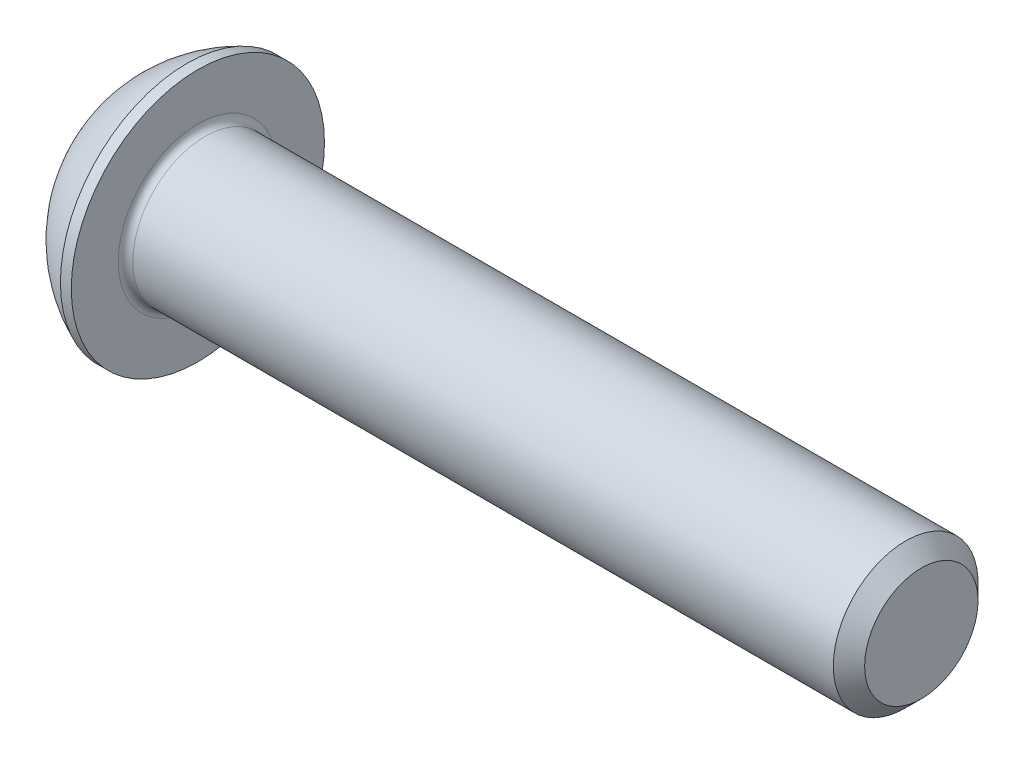
ISO-10303-21;
HEADER;
FILE_DESCRIPTION(('STEP AP214'),'2;1');
FILE_NAME('part.step','',(''),(''),'','','');
FILE_SCHEMA(('AUTOMOTIVE_DESIGN { 1 0 10303 214 1 1 1 1 }'));
ENDSEC;
DATA;
#1=APPLICATION_CONTEXT('core data for automotive mechanical design processes');
#2=APPLICATION_PROTOCOL_DEFINITION('international standard','automotive_design',2000,#1);
#3=PRODUCT_CONTEXT('',#1,'mechanical');
#4=PRODUCT('Part','Part','',(#3));
#5=PRODUCT_RELATED_PRODUCT_CATEGORY('part','',(#4));
#6=PRODUCT_DEFINITION_FORMATION('','',#4);
#7=PRODUCT_DEFINITION_CONTEXT('part definition',#1,'design');
#8=PRODUCT_DEFINITION('design','',#6,#7);
#9=PRODUCT_DEFINITION_SHAPE('','',#8);
#10=(LENGTH_UNIT() NAMED_UNIT(*) SI_UNIT(.MILLI.,.METRE.));
#11=(NAMED_UNIT(*) PLANE_ANGLE_UNIT() SI_UNIT($,.RADIAN.));
#12=(NAMED_UNIT(*) SI_UNIT($,.STERADIAN.) SOLID_ANGLE_UNIT());
#13=UNCERTAINTY_MEASURE_WITH_UNIT(LENGTH_MEASURE(1.E-05),#10,'distance_accuracy_value','');
#14=(GEOMETRIC_REPRESENTATION_CONTEXT(3) GLOBAL_UNCERTAINTY_ASSIGNED_CONTEXT((#13)) GLOBAL_UNIT_ASSIGNED_CONTEXT((#10,
#11,#12)) REPRESENTATION_CONTEXT('',''));
#15=CARTESIAN_POINT('',(0.,0.,0.));
#16=DIRECTION('',(0.,0.,1.));
#17=DIRECTION('',(1.,0.,0.));
#18=AXIS2_PLACEMENT_3D('',#15,#16,#17);
#19=CARTESIAN_POINT('',(0.,0.,0.));
#20=DIRECTION('',(-1.,0.,0.));
#21=DIRECTION('',(0.,0.,1.));
#22=AXIS2_PLACEMENT_3D('',#19,#20,#21);
#23=PLANE('',#22);
#24=CARTESIAN_POINT('',(0.,0.,0.));
#25=DIRECTION('',(-1.,0.,0.));
#26=DIRECTION('',(0.,0.,1.));
#27=AXIS2_PLACEMENT_3D('',#24,#25,#26);
#28=CIRCLE('',#27,0.875);
#29=CARTESIAN_POINT('',(0.,0.875,0.));
#30=VERTEX_POINT('',#29);
#31=EDGE_CURVE('E255',#30,#30,#28,.T.);
#32=ORIENTED_EDGE('',*,*,#31,.T.);
#33=EDGE_LOOP('',(#32));
#34=FACE_BOUND('',#33,.T.);
#35=CARTESIAN_POINT('',(0.,0.,0.));
#36=DIRECTION('',(-1.,0.,0.));
#37=DIRECTION('',(0.,0.,1.));
#38=AXIS2_PLACEMENT_3D('',#35,#36,#37);
#39=CIRCLE('',#38,0.715);
#40=CARTESIAN_POINT('',(0.,-0.71185022254595,0.0670392471711952));
#41=VERTEX_POINT('',#40);
#42=CARTESIAN_POINT('',(0.,-0.413982802373817,0.582960752828799));
#43=VERTEX_POINT('',#42);
#44=EDGE_CURVE('E238',#41,#43,#39,.T.);
#45=ORIENTED_EDGE('',*,*,#44,.F.);
#46=DIRECTION('',(0.,-0.499999999999998,-0.86602540378444));
#47=VECTOR('',#46,1.);
#48=CARTESIAN_POINT('',(0.,-0.750555349946509,0.));
#49=LINE('',#48,#47);
#50=CARTESIAN_POINT('',(0.,-0.750555349946509,0.));
#51=VERTEX_POINT('',#50);
#52=EDGE_CURVE('E436',#41,#51,#49,.T.);
#53=ORIENTED_EDGE('',*,*,#52,.T.);
#54=DIRECTION('',(0.,0.499999999999995,-0.866025403784441));
#55=VECTOR('',#54,1.);
#56=CARTESIAN_POINT('',(0.,-0.375277674973257,-0.65));
#57=LINE('',#56,#55);
#58=CARTESIAN_POINT('',(0.,-0.71185022254595,-0.0670392471711957));
#59=VERTEX_POINT('',#58);
#60=EDGE_CURVE('E188',#51,#59,#57,.T.);
#61=ORIENTED_EDGE('',*,*,#60,.T.);
#62=CARTESIAN_POINT('',(0.,-0.413982802373821,-0.582960752828796));
#63=VERTEX_POINT('',#62);
#64=EDGE_CURVE('E465',#63,#59,#39,.T.);
#65=ORIENTED_EDGE('',*,*,#64,.F.);
#66=CARTESIAN_POINT('',(0.,-0.375277674973257,-0.65));
#67=VERTEX_POINT('',#66);
#68=EDGE_CURVE('E435',#63,#67,#57,.T.);
#69=ORIENTED_EDGE('',*,*,#68,.T.);
#70=DIRECTION('',(0.,1.,0.));
#71=VECTOR('',#70,1.);
#72=CARTESIAN_POINT('',(0.,0.375277674973258,-0.65));
#73=LINE('',#72,#71);
#74=CARTESIAN_POINT('',(0.,-0.297867420172128,-0.65));
#75=VERTEX_POINT('',#74);
#76=EDGE_CURVE('E427',#67,#75,#73,.T.);
#77=ORIENTED_EDGE('',*,*,#76,.T.);
#78=CARTESIAN_POINT('',(0.,0.297867420172128,-0.65));
#79=VERTEX_POINT('',#78);
#80=EDGE_CURVE('E429',#79,#75,#39,.T.);
#81=ORIENTED_EDGE('',*,*,#80,.F.);
#82=CARTESIAN_POINT('',(0.,0.375277674973258,-0.65));
#83=VERTEX_POINT('',#82);
#84=EDGE_CURVE('E418',#79,#83,#73,.T.);
#85=ORIENTED_EDGE('',*,*,#84,.T.);
#86=DIRECTION('',(0.,0.499999999999999,0.866025403784439));
#87=VECTOR('',#86,1.);
#88=CARTESIAN_POINT('',(0.,0.750555349946514,0.));
#89=LINE('',#88,#87);
#90=CARTESIAN_POINT('',(0.,0.413982802373823,-0.582960752828795));
#91=VERTEX_POINT('',#90);
#92=EDGE_CURVE('E422',#83,#91,#89,.T.);
#93=ORIENTED_EDGE('',*,*,#92,.T.);
#94=CARTESIAN_POINT('',(0.,0.711850222545949,-0.0670392471712054));
#95=VERTEX_POINT('',#94);
#96=EDGE_CURVE('E467',#95,#91,#39,.T.);
#97=ORIENTED_EDGE('',*,*,#96,.F.);
#98=CARTESIAN_POINT('',(0.,0.750555349946514,0.));
#99=VERTEX_POINT('',#98);
#100=EDGE_CURVE('E424',#95,#99,#89,.T.);
#101=ORIENTED_EDGE('',*,*,#100,.T.);
#102=DIRECTION('',(0.,-0.500000000000001,0.866025403784438));
#103=VECTOR('',#102,1.);
#104=CARTESIAN_POINT('',(0.,0.375277674973258,0.649999999999998));
#105=LINE('',#104,#103);
#106=CARTESIAN_POINT('',(0.,0.711850222545949,0.0670392471712051));
#107=VERTEX_POINT('',#106);
#108=EDGE_CURVE('E407',#99,#107,#105,.T.);
#109=ORIENTED_EDGE('',*,*,#108,.T.);
#110=CARTESIAN_POINT('',(0.,0.413982802373821,0.582960752828796));
#111=VERTEX_POINT('',#110);
#112=EDGE_CURVE('E237',#111,#107,#39,.T.);
#113=ORIENTED_EDGE('',*,*,#112,.F.);
#114=CARTESIAN_POINT('',(0.,0.375277674973258,0.649999999999998));
#115=VERTEX_POINT('',#114);
#116=EDGE_CURVE('E403',#111,#115,#105,.T.);
#117=ORIENTED_EDGE('',*,*,#116,.T.);
#118=DIRECTION('',(0.,-1.,0.));
#119=VECTOR('',#118,1.);
#120=CARTESIAN_POINT('',(0.,-0.375277674973256,0.649999999999997));
#121=LINE('',#120,#119);
#122=CARTESIAN_POINT('',(0.,0.297867420172133,0.649999999999998));
#123=VERTEX_POINT('',#122);
#124=EDGE_CURVE('E176',#115,#123,#121,.T.);
#125=ORIENTED_EDGE('',*,*,#124,.T.);
#126=CARTESIAN_POINT('',(0.,-0.297867420172135,0.649999999999997));
#127=VERTEX_POINT('',#126);
#128=EDGE_CURVE('E234',#127,#123,#39,.T.);
#129=ORIENTED_EDGE('',*,*,#128,.F.);
#130=CARTESIAN_POINT('',(0.,-0.375277674973256,0.649999999999997));
#131=VERTEX_POINT('',#130);
#132=EDGE_CURVE('E401',#127,#131,#121,.T.);
#133=ORIENTED_EDGE('',*,*,#132,.T.);
#134=EDGE_CURVE('E434',#131,#43,#49,.T.);
#135=ORIENTED_EDGE('',*,*,#134,.T.);
#136=EDGE_LOOP('',(#45,#53,#61,#65,#69,#77,#81,#85,#93,#97,#101,#109,#113,#117,#125,#129,#133,#135));
#137=FACE_BOUND('',#136,.T.);
#138=ADVANCED_FACE('F41',(#34,#137),#23,.T.);
#139=CARTESIAN_POINT('',(0.,0.,0.));
#140=DIRECTION('',(-1.,0.,0.));
#141=DIRECTION('',(0.,0.,1.));
#142=AXIS2_PLACEMENT_3D('',#139,#140,#141);
#143=CYLINDRICAL_SURFACE('',#142,0.715);
#144=CARTESIAN_POINT('',(0.6,0.,0.));
#145=DIRECTION('',(-1.,0.,0.));
#146=DIRECTION('',(0.,0.,1.));
#147=AXIS2_PLACEMENT_3D('',#144,#145,#146);
#148=CIRCLE('',#147,0.715);
#149=CARTESIAN_POINT('',(0.6,-0.71185022254595,0.0670392471711951));
#150=VERTEX_POINT('',#149);
#151=CARTESIAN_POINT('',(0.6,-0.413982802373817,0.582960752828799));
#152=VERTEX_POINT('',#151);
#153=EDGE_CURVE('E460',#150,#152,#148,.T.);
#154=ORIENTED_EDGE('',*,*,#153,.F.);
#155=DIRECTION('',(-1.,0.,0.));
#156=VECTOR('',#155,1.);
#157=CARTESIAN_POINT('',(0.,-0.71185022254595,0.0670392471711949));
#158=LINE('',#157,#156);
#159=EDGE_CURVE('E173',#150,#41,#158,.T.);
#160=ORIENTED_EDGE('',*,*,#159,.T.);
#161=ORIENTED_EDGE('',*,*,#44,.T.);
#162=DIRECTION('',(-1.,0.,0.));
#163=VECTOR('',#162,1.);
#164=CARTESIAN_POINT('',(0.,-0.413982802373817,0.5829607528288));
#165=LINE('',#164,#163);
#166=EDGE_CURVE('E228',#43,#152,#165,.F.);
#167=ORIENTED_EDGE('',*,*,#166,.T.);
#168=EDGE_LOOP('',(#154,#160,#161,#167));
#169=FACE_BOUND('',#168,.T.);
#170=ADVANCED_FACE('F277',(#169),#143,.F.);
#171=CARTESIAN_POINT('',(0.6,-0.413982802373821,-0.582960752828796));
#172=VERTEX_POINT('',#171);
#173=CARTESIAN_POINT('',(0.6,-0.71185022254595,-0.0670392471711957));
#174=VERTEX_POINT('',#173);
#175=EDGE_CURVE('E455',#172,#174,#148,.T.);
#176=ORIENTED_EDGE('',*,*,#175,.F.);
#177=DIRECTION('',(-1.,0.,0.));
#178=VECTOR('',#177,1.);
#179=CARTESIAN_POINT('',(0.,-0.413982802373821,-0.582960752828796));
#180=LINE('',#179,#178);
#181=EDGE_CURVE('E223',#172,#63,#180,.T.);
#182=ORIENTED_EDGE('',*,*,#181,.T.);
#183=ORIENTED_EDGE('',*,*,#64,.T.);
#184=DIRECTION('',(-1.,0.,0.));
#185=VECTOR('',#184,1.);
#186=CARTESIAN_POINT('',(0.,-0.71185022254595,-0.0670392471711957));
#187=LINE('',#186,#185);
#188=EDGE_CURVE('E222',#59,#174,#187,.F.);
#189=ORIENTED_EDGE('',*,*,#188,.T.);
#190=EDGE_LOOP('',(#176,#182,#183,#189));
#191=FACE_BOUND('',#190,.T.);
#192=ADVANCED_FACE('F285',(#191),#143,.F.);
#193=CARTESIAN_POINT('',(0.6,0.297867420172128,-0.65));
#194=VERTEX_POINT('',#193);
#195=CARTESIAN_POINT('',(0.6,-0.297867420172128,-0.65));
#196=VERTEX_POINT('',#195);
#197=EDGE_CURVE('E453',#194,#196,#148,.T.);
#198=ORIENTED_EDGE('',*,*,#197,.F.);
#199=DIRECTION('',(-1.,0.,0.));
#200=VECTOR('',#199,1.);
#201=CARTESIAN_POINT('',(0.,0.297867420172128,-0.65));
#202=LINE('',#201,#200);
#203=EDGE_CURVE('E219',#194,#79,#202,.T.);
#204=ORIENTED_EDGE('',*,*,#203,.T.);
#205=ORIENTED_EDGE('',*,*,#80,.T.);
#206=DIRECTION('',(-1.,0.,0.));
#207=VECTOR('',#206,1.);
#208=CARTESIAN_POINT('',(0.,-0.297867420172128,-0.65));
#209=LINE('',#208,#207);
#210=EDGE_CURVE('E215',#75,#196,#209,.F.);
#211=ORIENTED_EDGE('',*,*,#210,.T.);
#212=EDGE_LOOP('',(#198,#204,#205,#211));
#213=FACE_BOUND('',#212,.T.);
#214=ADVANCED_FACE('F475',(#213),#143,.F.);
#215=CARTESIAN_POINT('',(0.6,0.711850222545949,-0.0670392471712054));
#216=VERTEX_POINT('',#215);
#217=CARTESIAN_POINT('',(0.6,0.413982802373823,-0.582960752828795));
#218=VERTEX_POINT('',#217);
#219=EDGE_CURVE('E375',#216,#218,#148,.T.);
#220=ORIENTED_EDGE('',*,*,#219,.F.);
#221=DIRECTION('',(-1.,0.,0.));
#222=VECTOR('',#221,1.);
#223=CARTESIAN_POINT('',(0.,0.711850222545949,-0.0670392471712054));
#224=LINE('',#223,#222);
#225=EDGE_CURVE('E212',#216,#95,#224,.T.);
#226=ORIENTED_EDGE('',*,*,#225,.T.);
#227=ORIENTED_EDGE('',*,*,#96,.T.);
#228=DIRECTION('',(-1.,0.,0.));
#229=VECTOR('',#228,1.);
#230=CARTESIAN_POINT('',(0.,0.413982802373823,-0.582960752828795));
#231=LINE('',#230,#229);
#232=EDGE_CURVE('E209',#91,#218,#231,.F.);
#233=ORIENTED_EDGE('',*,*,#232,.T.);
#234=EDGE_LOOP('',(#220,#226,#227,#233));
#235=FACE_BOUND('',#234,.T.);
#236=ADVANCED_FACE('F468',(#235),#143,.F.);
#237=CARTESIAN_POINT('',(0.6,0.413982802373821,0.582960752828796));
#238=VERTEX_POINT('',#237);
#239=CARTESIAN_POINT('',(0.6,0.711850222545949,0.0670392471712051));
#240=VERTEX_POINT('',#239);
#241=EDGE_CURVE('E232',#238,#240,#148,.T.);
#242=ORIENTED_EDGE('',*,*,#241,.F.);
#243=DIRECTION('',(-1.,0.,0.));
#244=VECTOR('',#243,1.);
#245=CARTESIAN_POINT('',(0.,0.413982802373821,0.582960752828796));
#246=LINE('',#245,#244);
#247=EDGE_CURVE('E207',#238,#111,#246,.T.);
#248=ORIENTED_EDGE('',*,*,#247,.T.);
#249=ORIENTED_EDGE('',*,*,#112,.T.);
#250=DIRECTION('',(-1.,0.,0.));
#251=VECTOR('',#250,1.);
#252=CARTESIAN_POINT('',(0.,0.711850222545949,0.0670392471712052));
#253=LINE('',#252,#251);
#254=EDGE_CURVE('E203',#107,#240,#253,.F.);
#255=ORIENTED_EDGE('',*,*,#254,.T.);
#256=EDGE_LOOP('',(#242,#248,#249,#255));
#257=FACE_BOUND('',#256,.T.);
#258=ADVANCED_FACE('F385',(#257),#143,.F.);
#259=CARTESIAN_POINT('',(0.6,-0.297867420172135,0.649999999999997));
#260=VERTEX_POINT('',#259);
#261=CARTESIAN_POINT('',(0.6,0.297867420172133,0.649999999999998));
#262=VERTEX_POINT('',#261);
#263=EDGE_CURVE('E229',#260,#262,#148,.T.);
#264=ORIENTED_EDGE('',*,*,#263,.F.);
#265=DIRECTION('',(-1.,0.,0.));
#266=VECTOR('',#265,1.);
#267=CARTESIAN_POINT('',(0.,-0.297867420172135,0.649999999999997));
#268=LINE('',#267,#266);
#269=EDGE_CURVE('E195',#260,#127,#268,.T.);
#270=ORIENTED_EDGE('',*,*,#269,.T.);
#271=ORIENTED_EDGE('',*,*,#128,.T.);
#272=DIRECTION('',(-1.,0.,0.));
#273=VECTOR('',#272,1.);
#274=CARTESIAN_POINT('',(0.,0.297867420172133,0.649999999999998));
#275=LINE('',#274,#273);
#276=EDGE_CURVE('E191',#123,#262,#275,.F.);
#277=ORIENTED_EDGE('',*,*,#276,.T.);
#278=EDGE_LOOP('',(#264,#270,#271,#277));
#279=FACE_BOUND('',#278,.T.);
#280=ADVANCED_FACE('F283',(#279),#143,.F.);
#281=CARTESIAN_POINT('',(1.68388157894737,0.,0.));
#282=DIRECTION('',(-1.,0.,0.));
#283=DIRECTION('',(0.,1.,0.));
#284=AXIS2_PLACEMENT_3D('',#281,#282,#283);
#285=SPHERICAL_SURFACE('',#284,1.89765175201308);
#286=CARTESIAN_POINT('',(0.95,0.,0.));
#287=DIRECTION('',(-1.,0.,0.));
#288=DIRECTION('',(0.,0.,1.));
#289=AXIS2_PLACEMENT_3D('',#286,#287,#288);
#290=CIRCLE('',#289,1.75);
#291=CARTESIAN_POINT('',(0.95,1.75,0.));
#292=VERTEX_POINT('',#291);
#293=EDGE_CURVE('E248',#292,#292,#290,.T.);
#294=CARTESIAN_POINT('',(0.95,1.75,0.));
#295=CARTESIAN_POINT('',(0.937340169559538,1.74469098940027,0.));
#296=CARTESIAN_POINT('',(0.924737968908448,1.73924455835412,0.));
#297=CARTESIAN_POINT('',(0.899654717595099,1.72807952164054,0.));
#298=CARTESIAN_POINT('',(0.887173666932838,1.7223609159731,0.));
#299=CARTESIAN_POINT('',(0.862338606007229,1.7106541962885,0.));
#300=CARTESIAN_POINT('',(0.849984595743881,1.70466608227132,0.));
#301=CARTESIAN_POINT('',(0.825409430903376,1.69242317344065,0.));
#302=CARTESIAN_POINT('',(0.81318827632622,1.68616837862716,0.));
#303=CARTESIAN_POINT('',(0.788884579669412,1.67339505215556,0.));
#304=CARTESIAN_POINT('',(0.77680203758976,1.66687652049746,0.));
#305=CARTESIAN_POINT('',(0.752781256357558,1.65357879096983,0.));
#306=CARTESIAN_POINT('',(0.740843017205007,1.64679959310029,0.));
#307=CARTESIAN_POINT('',(0.71711646458663,1.63298372389127,0.));
#308=CARTESIAN_POINT('',(0.705328151120803,1.6259470525518,0.));
#309=CARTESIAN_POINT('',(0.681907001944365,1.61161955058688,0.));
#310=CARTESIAN_POINT('',(0.670274166233754,1.60432871996143,0.));
#311=CARTESIAN_POINT('',(0.647169451430108,1.58949633326558,0.));
#312=CARTESIAN_POINT('',(0.635697572337074,1.58195477719518,0.));
#313=CARTESIAN_POINT('',(0.612920173817592,1.56662449155034,0.));
#314=CARTESIAN_POINT('',(0.601614654391145,1.55883576197591,0.));
#315=CARTESIAN_POINT('',(0.579175299902932,1.54301479767485,0.));
#316=CARTESIAN_POINT('',(0.568041464841166,1.53498256294822,0.));
#317=CARTESIAN_POINT('',(0.545950722919735,1.51867837138209,0.));
#318=CARTESIAN_POINT('',(0.534993816060069,1.51040641454259,0.));
#319=CARTESIAN_POINT('',(0.51326209105034,1.49362667469462,0.));
#320=CARTESIAN_POINT('',(0.502487272900276,1.48511889168615,0.));
#321=CARTESIAN_POINT('',(0.481124800056695,1.46787150651415,0.));
#322=CARTESIAN_POINT('',(0.470537145363177,1.45913190435061,0.));
#323=CARTESIAN_POINT('',(0.449553986028991,1.44142499706503,0.));
#324=CARTESIAN_POINT('',(0.439158481388324,1.43245769194298,0.));
#325=CARTESIAN_POINT('',(0.418564518256898,1.41429960218096,0.));
#326=CARTESIAN_POINT('',(0.408366059766139,1.40510881754099,0.));
#327=CARTESIAN_POINT('',(0.388170992226373,1.38650809743857,0.));
#328=CARTESIAN_POINT('',(0.378174383177366,1.37709816197613,0.));
#329=CARTESIAN_POINT('',(0.35838772274546,1.35806357214034,0.));
#330=CARTESIAN_POINT('',(0.348597671362561,1.348438917767,0.));
#331=CARTESIAN_POINT('',(0.32922873720226,1.32897942314977,0.));
#332=CARTESIAN_POINT('',(0.319649854424858,1.31914458290588,0.));
#333=CARTESIAN_POINT('',(0.30070776895829,1.29926934858169,0.));
#334=CARTESIAN_POINT('',(0.291344566269124,1.28922895450139,0.));
#335=CARTESIAN_POINT('',(0.272838250880315,1.26894734135071,0.));
#336=CARTESIAN_POINT('',(0.263695138180673,1.25870612228032,0.));
#337=CARTESIAN_POINT('',(0.245633309013679,1.2380276825808,0.));
#338=CARTESIAN_POINT('',(0.236714592546328,1.22759046195167,0.));
#339=CARTESIAN_POINT('',(0.219105756400304,1.20652493487909,0.));
#340=CARTESIAN_POINT('',(0.21041563672163,1.19589662843564,0.));
#341=CARTESIAN_POINT('',(0.193268087043462,1.17445393547738,0.));
#342=CARTESIAN_POINT('',(0.184810657043969,1.16363954896256,0.));
#343=CARTESIAN_POINT('',(0.168132470025252,1.14182978924308,0.));
#344=CARTESIAN_POINT('',(0.159911713006028,1.13083441603841,0.));
#345=CARTESIAN_POINT('',(0.143710743767988,1.10866786156894,0.));
#346=CARTESIAN_POINT('',(0.135730531549171,1.09749668030414,0.));
#347=CARTESIAN_POINT('',(0.120014410485326,1.07498377112164,0.));
#348=CARTESIAN_POINT('',(0.112278501640297,1.06364204320393,0.));
#349=CARTESIAN_POINT('',(0.0970546306648887,1.04079338254035,0.));
#350=CARTESIAN_POINT('',(0.0895666685345088,1.02928644979447,0.));
#351=CARTESIAN_POINT('',(0.0748422181852083,1.00611279876044,0.));
#352=CARTESIAN_POINT('',(0.0676057299662877,0.994446080472284,0.));
#353=CARTESIAN_POINT('',(0.0533876338292878,0.970958354192094,0.));
#354=CARTESIAN_POINT('',(0.0464060259112086,0.959137346200057,0.));
#355=CARTESIAN_POINT('',(0.0327009855576053,0.935346604180128,0.));
#356=CARTESIAN_POINT('',(0.0259775531220811,0.923376870152236,0.));
#357=CARTESIAN_POINT('',(0.0127920043413564,0.899294327831803,0.));
#358=CARTESIAN_POINT('',(0.00632988799615577,0.887181519539262,0.));
#359=CARTESIAN_POINT('',(0.,0.875,0.));
#360=B_SPLINE_CURVE_WITH_KNOTS('',3,(#294,#295,#296,#297,#298,#299,#300,#301,#302,#303,#304,
#305,#306,#307,#308,#309,#310,#311,#312,#313,#314,#315,#316,#317,#318,#319,#320,#321,#322,#323,
#324,#325,#326,#327,#328,#329,#330,#331,#332,#333,#334,#335,#336,#337,#338,#339,#340,#341,#342,
#343,#344,#345,#346,#347,#348,#349,#350,#351,#352,#353,#354,#355,#356,#357,#358,#359),
.UNSPECIFIED.,.F.,.F.,(4,2,2,2,2,2,2,2,2,2,2,2,2,2,2,2,2,2,2,2,2,2,2,2,2,2,2,2,2,2,2,2,4),(0.,
0.0411830717721068,0.0823661435442138,0.12354921531632,0.164732287088427,0.205915358860534,
0.247098430632641,0.288281502404748,0.329464574176855,0.370647645948962,0.411830717721068,
0.453013789493175,0.494196861265282,0.535379933037389,0.576563004809496,0.617746076581603,
0.658929148353709,0.700112220125816,0.741295291897923,0.78247836367003,0.823661435442137,
0.864844507214244,0.906027578986351,0.947210650758457,0.988393722530564,1.02957679430267,
1.07075986607478,1.11194293784688,1.15312600961899,1.1943090813911,1.23549215316321,
1.27667522493531,1.31785829670742),.UNSPECIFIED.);
#361=EDGE_CURVE('BSEAM288',#292,#30,#360,.T.);
#362=ORIENTED_EDGE('',*,*,#293,.T.);
#363=ORIENTED_EDGE('',*,*,#31,.F.);
#364=ORIENTED_EDGE('',*,*,#361,.T.);
#365=ORIENTED_EDGE('',*,*,#361,.F.);
#366=EDGE_LOOP('',(#362,#364,#363,#365));
#367=FACE_BOUND('',#366,.T.);
#368=ADVANCED_FACE('F288',(#367),#285,.T.);
#369=CARTESIAN_POINT('',(0.,0.,0.));
#370=DIRECTION('',(-1.,0.,0.));
#371=DIRECTION('',(0.,0.,1.));
#372=AXIS2_PLACEMENT_3D('',#369,#370,#371);
#373=CYLINDRICAL_SURFACE('',#372,1.75);
#374=ORIENTED_EDGE('',*,*,#293,.F.);
#375=EDGE_LOOP('',(#374));
#376=FACE_BOUND('',#375,.T.);
#377=CARTESIAN_POINT('',(1.1,0.,0.));
#378=DIRECTION('',(-1.,0.,0.));
#379=DIRECTION('',(0.,0.,1.));
#380=AXIS2_PLACEMENT_3D('',#377,#378,#379);
#381=CIRCLE('',#380,1.75);
#382=CARTESIAN_POINT('',(1.1,0.,1.75));
#383=VERTEX_POINT('',#382);
#384=EDGE_CURVE('E246',#383,#383,#381,.T.);
#385=ORIENTED_EDGE('',*,*,#384,.T.);
#386=EDGE_LOOP('',(#385));
#387=FACE_BOUND('',#386,.T.);
#388=ADVANCED_FACE('F293',(#376,#387),#373,.T.);
#389=CARTESIAN_POINT('',(1.1,0.999999999999992,0.));
#390=DIRECTION('',(-1.,0.,0.));
#391=DIRECTION('',(0.,0.,1.));
#392=AXIS2_PLACEMENT_3D('',#389,#390,#391);
#393=PLANE('',#392);
#394=CARTESIAN_POINT('',(1.1,0.,0.));
#395=DIRECTION('',(-1.,0.,0.));
#396=DIRECTION('',(0.,0.,1.));
#397=AXIS2_PLACEMENT_3D('',#394,#395,#396);
#398=CIRCLE('',#397,1.09999999999999);
#399=CARTESIAN_POINT('',(1.1,0.,1.09999999999999));
#400=VERTEX_POINT('',#399);
#401=EDGE_CURVE('E47',#400,#400,#398,.T.);
#402=ORIENTED_EDGE('',*,*,#401,.T.);
#403=EDGE_LOOP('',(#402));
#404=FACE_BOUND('',#403,.T.);
#405=ORIENTED_EDGE('',*,*,#384,.F.);
#406=EDGE_LOOP('',(#405));
#407=FACE_BOUND('',#406,.T.);
#408=ADVANCED_FACE('F257',(#404,#407),#393,.F.);
#409=CARTESIAN_POINT('',(0.,0.,0.));
#410=DIRECTION('',(-1.,0.,0.));
#411=DIRECTION('',(0.,0.,1.));
#412=AXIS2_PLACEMENT_3D('',#409,#410,#411);
#413=CYLINDRICAL_SURFACE('',#412,0.999999999999993);
#414=CARTESIAN_POINT('',(1.2,0.,0.));
#415=DIRECTION('',(-1.,0.,0.));
#416=DIRECTION('',(0.,0.,1.));
#417=AXIS2_PLACEMENT_3D('',#414,#415,#416);
#418=CIRCLE('',#417,0.999999999999993);
#419=CARTESIAN_POINT('',(1.2,0.,0.999999999999993));
#420=VERTEX_POINT('',#419);
#421=EDGE_CURVE('E11',#420,#420,#418,.F.);
#422=ORIENTED_EDGE('',*,*,#421,.T.);
#423=EDGE_LOOP('',(#422));
#424=FACE_BOUND('',#423,.T.);
#425=CARTESIAN_POINT('',(10.8835,0.,0.));
#426=DIRECTION('',(-1.,0.,0.));
#427=DIRECTION('',(0.,0.,1.));
#428=AXIS2_PLACEMENT_3D('',#425,#426,#427);
#429=CIRCLE('',#428,0.999999999999993);
#430=CARTESIAN_POINT('',(10.8835,0.,0.999999999999993));
#431=VERTEX_POINT('',#430);
#432=EDGE_CURVE('E243',#431,#431,#429,.T.);
#433=ORIENTED_EDGE('',*,*,#432,.T.);
#434=EDGE_LOOP('',(#433));
#435=FACE_BOUND('',#434,.T.);
#436=ADVANCED_FACE('F296',(#424,#435),#413,.T.);
#437=CARTESIAN_POINT('',(11.1,0.,0.));
#438=DIRECTION('',(-1.,0.,0.));
#439=DIRECTION('',(0.,0.,1.));
#440=AXIS2_PLACEMENT_3D('',#437,#438,#439);
#441=CONICAL_SURFACE('',#440,0.7835,0.785398163397444);
#442=ORIENTED_EDGE('',*,*,#432,.F.);
#443=EDGE_LOOP('',(#442));
#444=FACE_BOUND('',#443,.T.);
#445=CARTESIAN_POINT('',(11.1,0.,0.));
#446=DIRECTION('',(-1.,0.,0.));
#447=DIRECTION('',(0.,0.,1.));
#448=AXIS2_PLACEMENT_3D('',#445,#446,#447);
#449=CIRCLE('',#448,0.7835);
#450=CARTESIAN_POINT('',(11.1,0.,0.7835));
#451=VERTEX_POINT('',#450);
#452=EDGE_CURVE('E239',#451,#451,#449,.T.);
#453=ORIENTED_EDGE('',*,*,#452,.T.);
#454=EDGE_LOOP('',(#453));
#455=FACE_BOUND('',#454,.T.);
#456=ADVANCED_FACE('F271',(#444,#455),#441,.T.);
#457=CARTESIAN_POINT('',(11.1,0.,0.));
#458=DIRECTION('',(-1.,0.,0.));
#459=DIRECTION('',(0.,0.,1.));
#460=AXIS2_PLACEMENT_3D('',#457,#458,#459);
#461=PLANE('',#460);
#462=ORIENTED_EDGE('',*,*,#452,.F.);
#463=EDGE_LOOP('',(#462));
#464=FACE_BOUND('',#463,.T.);
#465=ADVANCED_FACE('F265',(#464),#461,.F.);
#466=CARTESIAN_POINT('',(1.2,0.,0.));
#467=DIRECTION('',(-1.,0.,0.));
#468=DIRECTION('',(0.,0.,1.));
#469=AXIS2_PLACEMENT_3D('',#466,#467,#468);
#470=TOROIDAL_SURFACE('',#469,1.09999999999999,0.1);
#471=ORIENTED_EDGE('',*,*,#421,.F.);
#472=EDGE_LOOP('',(#471));
#473=FACE_BOUND('',#472,.T.);
#474=ORIENTED_EDGE('',*,*,#401,.F.);
#475=EDGE_LOOP('',(#474));
#476=FACE_BOUND('',#475,.T.);
#477=ADVANCED_FACE('F43',(#473,#476),#470,.F.);
#478=CARTESIAN_POINT('',(1.01280544247059,0.,0.));
#479=DIRECTION('',(-1.,0.,0.));
#480=DIRECTION('',(0.,0.,1.));
#481=AXIS2_PLACEMENT_3D('',#478,#479,#480);
#482=CONICAL_SURFACE('',#481,0.,1.04719755119659);
#483=EDGE_CURVE('E233',#262,#238,#148,.T.);
#484=ORIENTED_EDGE('',*,*,#483,.T.);
#485=ORIENTED_EDGE('',*,*,#241,.T.);
#486=EDGE_CURVE('E362',#240,#216,#148,.T.);
#487=ORIENTED_EDGE('',*,*,#486,.T.);
#488=ORIENTED_EDGE('',*,*,#219,.T.);
#489=EDGE_CURVE('E457',#218,#194,#148,.T.);
#490=ORIENTED_EDGE('',*,*,#489,.T.);
#491=ORIENTED_EDGE('',*,*,#197,.T.);
#492=EDGE_CURVE('E451',#196,#172,#148,.T.);
#493=ORIENTED_EDGE('',*,*,#492,.T.);
#494=ORIENTED_EDGE('',*,*,#175,.T.);
#495=EDGE_CURVE('E185',#174,#150,#148,.T.);
#496=ORIENTED_EDGE('',*,*,#495,.T.);
#497=ORIENTED_EDGE('',*,*,#153,.T.);
#498=EDGE_CURVE('E456',#152,#260,#148,.T.);
#499=ORIENTED_EDGE('',*,*,#498,.T.);
#500=ORIENTED_EDGE('',*,*,#263,.T.);
#501=EDGE_LOOP('',(#484,#485,#487,#488,#490,#491,#493,#494,#496,#497,#499,#500));
#502=FACE_BOUND('',#501,.T.);
#503=CARTESIAN_POINT('',(1.01280544247059,0.,0.));
#504=VERTEX_POINT('',#503);
#505=VERTEX_LOOP('',#504);
#506=FACE_BOUND('',#505,.T.);
#507=ADVANCED_FACE('F262',(#502,#506),#482,.F.);
#508=CARTESIAN_POINT('',(0.6,-1.12583302491976,-0.65));
#509=DIRECTION('',(1.,0.,0.));
#510=DIRECTION('',(0.,0.,-1.));
#511=AXIS2_PLACEMENT_3D('',#508,#509,#510);
#512=PLANE('',#511);
#513=ORIENTED_EDGE('',*,*,#492,.F.);
#514=DIRECTION('',(0.,1.,0.));
#515=VECTOR('',#514,1.);
#516=CARTESIAN_POINT('',(0.6,0.375277674973258,-0.65));
#517=LINE('',#516,#515);
#518=CARTESIAN_POINT('',(0.6,-0.375277674973257,-0.65));
#519=VERTEX_POINT('',#518);
#520=EDGE_CURVE('E439',#519,#196,#517,.T.);
#521=ORIENTED_EDGE('',*,*,#520,.F.);
#522=DIRECTION('',(0.,0.499999999999995,-0.866025403784441));
#523=VECTOR('',#522,1.);
#524=CARTESIAN_POINT('',(0.6,-0.375277674973257,-0.65));
#525=LINE('',#524,#523);
#526=EDGE_CURVE('E187',#172,#519,#525,.T.);
#527=ORIENTED_EDGE('',*,*,#526,.F.);
#528=EDGE_LOOP('',(#513,#521,#527));
#529=FACE_BOUND('',#528,.T.);
#530=ADVANCED_FACE('F269',(#529),#512,.F.);
#531=CARTESIAN_POINT('',(0.6,0.375277674973258,-0.65));
#532=DIRECTION('',(0.,0.,1.));
#533=DIRECTION('',(1.,0.,0.));
#534=AXIS2_PLACEMENT_3D('',#531,#532,#533);
#535=PLANE('',#534);
#536=ORIENTED_EDGE('',*,*,#76,.F.);
#537=DIRECTION('',(-1.,0.,0.));
#538=VECTOR('',#537,1.);
#539=CARTESIAN_POINT('',(0.6,-0.375277674973257,-0.65));
#540=LINE('',#539,#538);
#541=EDGE_CURVE('E192',#519,#67,#540,.T.);
#542=ORIENTED_EDGE('',*,*,#541,.F.);
#543=ORIENTED_EDGE('',*,*,#520,.T.);
#544=ORIENTED_EDGE('',*,*,#210,.F.);
#545=EDGE_LOOP('',(#536,#542,#543,#544));
#546=FACE_BOUND('',#545,.T.);
#547=ADVANCED_FACE('F313',(#546),#535,.T.);
#548=CARTESIAN_POINT('',(0.6,-0.375277674973257,-0.65));
#549=DIRECTION('',(0.,0.866025403784441,0.499999999999995));
#550=DIRECTION('',(0.,-0.499999999999995,0.866025403784441));
#551=AXIS2_PLACEMENT_3D('',#548,#549,#550);
#552=PLANE('',#551);
#553=ORIENTED_EDGE('',*,*,#526,.T.);
#554=ORIENTED_EDGE('',*,*,#541,.T.);
#555=ORIENTED_EDGE('',*,*,#68,.F.);
#556=ORIENTED_EDGE('',*,*,#181,.F.);
#557=EDGE_LOOP('',(#553,#554,#555,#556));
#558=FACE_BOUND('',#557,.T.);
#559=ADVANCED_FACE('F312',(#558),#552,.T.);
#560=ORIENTED_EDGE('',*,*,#495,.F.);
#561=CARTESIAN_POINT('',(0.6,-0.750555349946509,0.));
#562=VERTEX_POINT('',#561);
#563=EDGE_CURVE('E177',#562,#174,#525,.T.);
#564=ORIENTED_EDGE('',*,*,#563,.F.);
#565=DIRECTION('',(0.,-0.499999999999998,-0.86602540378444));
#566=VECTOR('',#565,1.);
#567=CARTESIAN_POINT('',(0.6,-0.750555349946509,0.));
#568=LINE('',#567,#566);
#569=EDGE_CURVE('E63',#150,#562,#568,.T.);
#570=ORIENTED_EDGE('',*,*,#569,.F.);
#571=EDGE_LOOP('',(#560,#564,#570));
#572=FACE_BOUND('',#571,.T.);
#573=ADVANCED_FACE('F179',(#572),#512,.F.);
#574=ORIENTED_EDGE('',*,*,#60,.F.);
#575=DIRECTION('',(-1.,0.,0.));
#576=VECTOR('',#575,1.);
#577=CARTESIAN_POINT('',(0.6,-0.750555349946509,0.));
#578=LINE('',#577,#576);
#579=EDGE_CURVE('E167',#562,#51,#578,.T.);
#580=ORIENTED_EDGE('',*,*,#579,.F.);
#581=ORIENTED_EDGE('',*,*,#563,.T.);
#582=ORIENTED_EDGE('',*,*,#188,.F.);
#583=EDGE_LOOP('',(#574,#580,#581,#582));
#584=FACE_BOUND('',#583,.T.);
#585=ADVANCED_FACE('F189',(#584),#552,.T.);
#586=CARTESIAN_POINT('',(0.6,-0.750555349946509,0.));
#587=DIRECTION('',(0.,0.86602540378444,-0.499999999999998));
#588=DIRECTION('',(0.,0.499999999999998,0.86602540378444));
#589=AXIS2_PLACEMENT_3D('',#586,#587,#588);
#590=PLANE('',#589);
#591=ORIENTED_EDGE('',*,*,#569,.T.);
#592=ORIENTED_EDGE('',*,*,#579,.T.);
#593=ORIENTED_EDGE('',*,*,#52,.F.);
#594=ORIENTED_EDGE('',*,*,#159,.F.);
#595=EDGE_LOOP('',(#591,#592,#593,#594));
#596=FACE_BOUND('',#595,.T.);
#597=ADVANCED_FACE('F166',(#596),#590,.T.);
#598=ORIENTED_EDGE('',*,*,#498,.F.);
#599=CARTESIAN_POINT('',(0.6,-0.375277674973256,0.649999999999997));
#600=VERTEX_POINT('',#599);
#601=EDGE_CURVE('E174',#600,#152,#568,.T.);
#602=ORIENTED_EDGE('',*,*,#601,.F.);
#603=DIRECTION('',(0.,-1.,0.));
#604=VECTOR('',#603,1.);
#605=CARTESIAN_POINT('',(0.6,-0.375277674973256,0.649999999999997));
#606=LINE('',#605,#604);
#607=EDGE_CURVE('E57',#260,#600,#606,.T.);
#608=ORIENTED_EDGE('',*,*,#607,.F.);
#609=EDGE_LOOP('',(#598,#602,#608));
#610=FACE_BOUND('',#609,.T.);
#611=ADVANCED_FACE('F342',(#610),#512,.F.);
#612=CARTESIAN_POINT('',(0.6,-0.375277674973256,0.649999999999997));
#613=DIRECTION('',(0.,0.,-1.));
#614=DIRECTION('',(0.,1.,0.));
#615=AXIS2_PLACEMENT_3D('',#612,#613,#614);
#616=PLANE('',#615);
#617=ORIENTED_EDGE('',*,*,#607,.T.);
#618=DIRECTION('',(-1.,0.,0.));
#619=VECTOR('',#618,1.);
#620=CARTESIAN_POINT('',(0.6,-0.375277674973256,0.649999999999997));
#621=LINE('',#620,#619);
#622=EDGE_CURVE('E397',#600,#131,#621,.T.);
#623=ORIENTED_EDGE('',*,*,#622,.T.);
#624=ORIENTED_EDGE('',*,*,#132,.F.);
#625=ORIENTED_EDGE('',*,*,#269,.F.);
#626=EDGE_LOOP('',(#617,#623,#624,#625));
#627=FACE_BOUND('',#626,.T.);
#628=ADVANCED_FACE('F307',(#627),#616,.T.);
#629=ORIENTED_EDGE('',*,*,#134,.F.);
#630=ORIENTED_EDGE('',*,*,#622,.F.);
#631=ORIENTED_EDGE('',*,*,#601,.T.);
#632=ORIENTED_EDGE('',*,*,#166,.F.);
#633=EDGE_LOOP('',(#629,#630,#631,#632));
#634=FACE_BOUND('',#633,.T.);
#635=ADVANCED_FACE('F304',(#634),#590,.T.);
#636=ORIENTED_EDGE('',*,*,#483,.F.);
#637=CARTESIAN_POINT('',(0.6,0.375277674973258,0.649999999999998));
#638=VERTEX_POINT('',#637);
#639=EDGE_CURVE('E390',#638,#262,#606,.T.);
#640=ORIENTED_EDGE('',*,*,#639,.F.);
#641=DIRECTION('',(0.,-0.500000000000001,0.866025403784438));
#642=VECTOR('',#641,1.);
#643=CARTESIAN_POINT('',(0.6,0.375277674973258,0.649999999999998));
#644=LINE('',#643,#642);
#645=EDGE_CURVE('E380',#238,#638,#644,.T.);
#646=ORIENTED_EDGE('',*,*,#645,.F.);
#647=EDGE_LOOP('',(#636,#640,#646));
#648=FACE_BOUND('',#647,.T.);
#649=ADVANCED_FACE('F308',(#648),#512,.F.);
#650=ORIENTED_EDGE('',*,*,#124,.F.);
#651=DIRECTION('',(-1.,0.,0.));
#652=VECTOR('',#651,1.);
#653=CARTESIAN_POINT('',(0.6,0.375277674973258,0.649999999999998));
#654=LINE('',#653,#652);
#655=EDGE_CURVE('E393',#638,#115,#654,.T.);
#656=ORIENTED_EDGE('',*,*,#655,.F.);
#657=ORIENTED_EDGE('',*,*,#639,.T.);
#658=ORIENTED_EDGE('',*,*,#276,.F.);
#659=EDGE_LOOP('',(#650,#656,#657,#658));
#660=FACE_BOUND('',#659,.T.);
#661=ADVANCED_FACE('F332',(#660),#616,.T.);
#662=CARTESIAN_POINT('',(0.6,0.375277674973258,0.649999999999998));
#663=DIRECTION('',(0.,-0.866025403784438,-0.500000000000001));
#664=DIRECTION('',(0.,0.500000000000001,-0.866025403784438));
#665=AXIS2_PLACEMENT_3D('',#662,#663,#664);
#666=PLANE('',#665);
#667=ORIENTED_EDGE('',*,*,#645,.T.);
#668=ORIENTED_EDGE('',*,*,#655,.T.);
#669=ORIENTED_EDGE('',*,*,#116,.F.);
#670=ORIENTED_EDGE('',*,*,#247,.F.);
#671=EDGE_LOOP('',(#667,#668,#669,#670));
#672=FACE_BOUND('',#671,.T.);
#673=ADVANCED_FACE('F328',(#672),#666,.T.);
#674=ORIENTED_EDGE('',*,*,#486,.F.);
#675=CARTESIAN_POINT('',(0.6,0.750555349946514,0.));
#676=VERTEX_POINT('',#675);
#677=EDGE_CURVE('E370',#676,#240,#644,.T.);
#678=ORIENTED_EDGE('',*,*,#677,.F.);
#679=DIRECTION('',(0.,0.499999999999999,0.866025403784439));
#680=VECTOR('',#679,1.);
#681=CARTESIAN_POINT('',(0.6,0.750555349946514,0.));
#682=LINE('',#681,#680);
#683=EDGE_CURVE('E368',#216,#676,#682,.T.);
#684=ORIENTED_EDGE('',*,*,#683,.F.);
#685=EDGE_LOOP('',(#674,#678,#684));
#686=FACE_BOUND('',#685,.T.);
#687=ADVANCED_FACE('F329',(#686),#512,.F.);
#688=ORIENTED_EDGE('',*,*,#108,.F.);
#689=DIRECTION('',(-1.,0.,0.));
#690=VECTOR('',#689,1.);
#691=CARTESIAN_POINT('',(0.6,0.750555349946514,0.));
#692=LINE('',#691,#690);
#693=EDGE_CURVE('E376',#676,#99,#692,.T.);
#694=ORIENTED_EDGE('',*,*,#693,.F.);
#695=ORIENTED_EDGE('',*,*,#677,.T.);
#696=ORIENTED_EDGE('',*,*,#254,.F.);
#697=EDGE_LOOP('',(#688,#694,#695,#696));
#698=FACE_BOUND('',#697,.T.);
#699=ADVANCED_FACE('F325',(#698),#666,.T.);
#700=CARTESIAN_POINT('',(0.6,0.750555349946514,0.));
#701=DIRECTION('',(0.,-0.866025403784439,0.499999999999999));
#702=DIRECTION('',(0.,-0.499999999999999,-0.866025403784439));
#703=AXIS2_PLACEMENT_3D('',#700,#701,#702);
#704=PLANE('',#703);
#705=ORIENTED_EDGE('',*,*,#683,.T.);
#706=ORIENTED_EDGE('',*,*,#693,.T.);
#707=ORIENTED_EDGE('',*,*,#100,.F.);
#708=ORIENTED_EDGE('',*,*,#225,.F.);
#709=EDGE_LOOP('',(#705,#706,#707,#708));
#710=FACE_BOUND('',#709,.T.);
#711=ADVANCED_FACE('F323',(#710),#704,.T.);
#712=CARTESIAN_POINT('',(0.6,0.375277674973258,-0.65));
#713=VERTEX_POINT('',#712);
#714=EDGE_CURVE('E184',#194,#713,#517,.T.);
#715=ORIENTED_EDGE('',*,*,#714,.T.);
#716=DIRECTION('',(-1.,0.,0.));
#717=VECTOR('',#716,1.);
#718=CARTESIAN_POINT('',(0.6,0.375277674973258,-0.65));
#719=LINE('',#718,#717);
#720=EDGE_CURVE('E200',#713,#83,#719,.T.);
#721=ORIENTED_EDGE('',*,*,#720,.T.);
#722=ORIENTED_EDGE('',*,*,#84,.F.);
#723=ORIENTED_EDGE('',*,*,#203,.F.);
#724=EDGE_LOOP('',(#715,#721,#722,#723));
#725=FACE_BOUND('',#724,.T.);
#726=ADVANCED_FACE('F319',(#725),#535,.T.);
#727=ORIENTED_EDGE('',*,*,#489,.F.);
#728=EDGE_CURVE('E438',#713,#218,#682,.T.);
#729=ORIENTED_EDGE('',*,*,#728,.F.);
#730=ORIENTED_EDGE('',*,*,#714,.F.);
#731=EDGE_LOOP('',(#727,#729,#730));
#732=FACE_BOUND('',#731,.T.);
#733=ADVANCED_FACE('F322',(#732),#512,.F.);
#734=ORIENTED_EDGE('',*,*,#92,.F.);
#735=ORIENTED_EDGE('',*,*,#720,.F.);
#736=ORIENTED_EDGE('',*,*,#728,.T.);
#737=ORIENTED_EDGE('',*,*,#232,.F.);
#738=EDGE_LOOP('',(#734,#735,#736,#737));
#739=FACE_BOUND('',#738,.T.);
#740=ADVANCED_FACE('F316',(#739),#704,.T.);
#741=CLOSED_SHELL('',(#138,#170,#192,#214,#236,#258,#280,#368,#388,#408,#436,#456,#465,#477,
#507,#530,#547,#559,#573,#585,#597,#611,#628,#635,#649,#661,#673,#687,#699,#711,#726,#733,#740));
#742=MANIFOLD_SOLID_BREP('B2',#741);
#743=ADVANCED_BREP_SHAPE_REPRESENTATION('',(#18,#742),#14);
#744=SHAPE_DEFINITION_REPRESENTATION(#9,#743);
ENDSEC;
END-ISO-10303-21;
